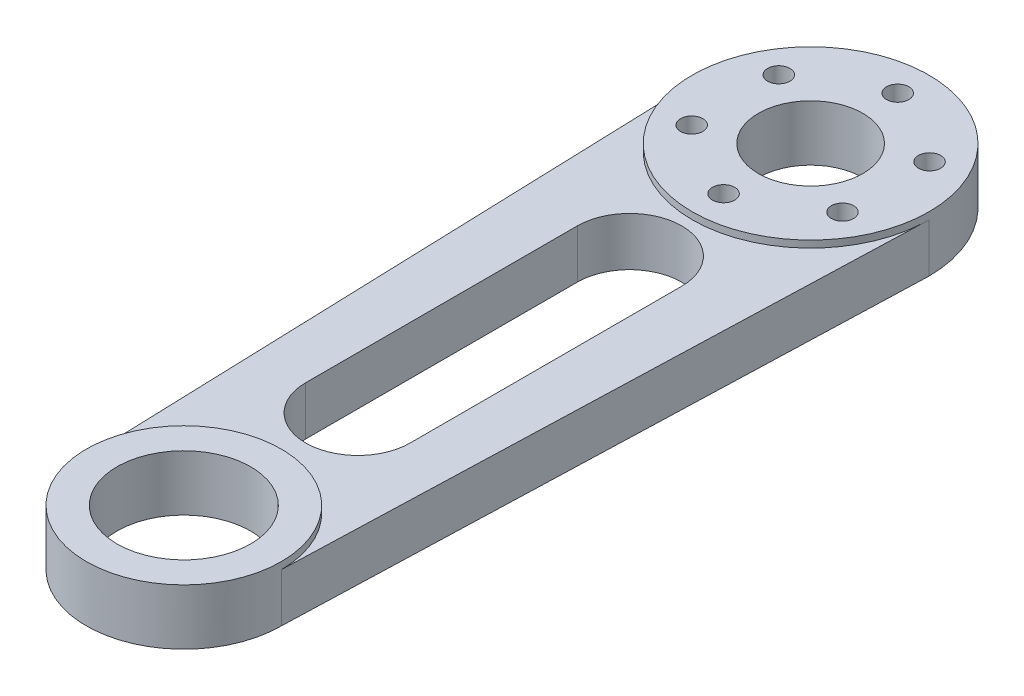
ISO-10303-21;
HEADER;
FILE_DESCRIPTION(('STEP AP214'),'2;1');
FILE_NAME('part.step','',(''),(''),'','','');
FILE_SCHEMA(('AUTOMOTIVE_DESIGN { 1 0 10303 214 1 1 1 1 }'));
ENDSEC;
DATA;
#1=APPLICATION_CONTEXT('core data for automotive mechanical design processes');
#2=APPLICATION_PROTOCOL_DEFINITION('international standard','automotive_design',2000,#1);
#3=PRODUCT_CONTEXT('',#1,'mechanical');
#4=PRODUCT('Part','Part','',(#3));
#5=PRODUCT_RELATED_PRODUCT_CATEGORY('part','',(#4));
#6=PRODUCT_DEFINITION_FORMATION('','',#4);
#7=PRODUCT_DEFINITION_CONTEXT('part definition',#1,'design');
#8=PRODUCT_DEFINITION('design','',#6,#7);
#9=PRODUCT_DEFINITION_SHAPE('','',#8);
#10=(LENGTH_UNIT() NAMED_UNIT(*) SI_UNIT(.MILLI.,.METRE.));
#11=(NAMED_UNIT(*) PLANE_ANGLE_UNIT() SI_UNIT($,.RADIAN.));
#12=(NAMED_UNIT(*) SI_UNIT($,.STERADIAN.) SOLID_ANGLE_UNIT());
#13=UNCERTAINTY_MEASURE_WITH_UNIT(LENGTH_MEASURE(1.E-05),#10,'distance_accuracy_value','');
#14=(GEOMETRIC_REPRESENTATION_CONTEXT(3) GLOBAL_UNCERTAINTY_ASSIGNED_CONTEXT((#13)) GLOBAL_UNIT_ASSIGNED_CONTEXT((#10,
#11,#12)) REPRESENTATION_CONTEXT('',''));
#15=CARTESIAN_POINT('',(0.,0.,0.));
#16=DIRECTION('',(0.,0.,1.));
#17=DIRECTION('',(1.,0.,0.));
#18=AXIS2_PLACEMENT_3D('',#15,#16,#17);
#19=CARTESIAN_POINT('',(0.,7.,0.));
#20=DIRECTION('',(0.,1.,0.));
#21=DIRECTION('',(0.,0.,1.));
#22=AXIS2_PLACEMENT_3D('',#19,#20,#21);
#23=PLANE('',#22);
#24=CARTESIAN_POINT('',(0.,7.,26.));
#25=DIRECTION('',(0.,1.,0.));
#26=DIRECTION('',(0.,0.,1.));
#27=AXIS2_PLACEMENT_3D('',#24,#25,#26);
#28=CIRCLE('',#27,7.5);
#29=CARTESIAN_POINT('',(7.5,7.,26.));
#30=VERTEX_POINT('',#29);
#31=CARTESIAN_POINT('',(-7.5,7.,26.));
#32=VERTEX_POINT('',#31);
#33=EDGE_CURVE('E59',#30,#32,#28,.T.);
#34=ORIENTED_EDGE('',*,*,#33,.F.);
#35=DIRECTION('',(0.,0.,-1.));
#36=VECTOR('',#35,1.);
#37=CARTESIAN_POINT('',(7.5,7.,26.));
#38=LINE('',#37,#36);
#39=CARTESIAN_POINT('',(7.50000000000001,7.,65.));
#40=VERTEX_POINT('',#39);
#41=EDGE_CURVE('E199',#40,#30,#38,.T.);
#42=ORIENTED_EDGE('',*,*,#41,.F.);
#43=CARTESIAN_POINT('',(0.,7.,65.));
#44=DIRECTION('',(0.,1.,0.));
#45=DIRECTION('',(0.,0.,1.));
#46=AXIS2_PLACEMENT_3D('',#43,#44,#45);
#47=CIRCLE('',#46,7.5);
#48=CARTESIAN_POINT('',(-7.49999999999999,7.,65.));
#49=VERTEX_POINT('',#48);
#50=EDGE_CURVE('E210',#49,#40,#47,.T.);
#51=ORIENTED_EDGE('',*,*,#50,.F.);
#52=DIRECTION('',(0.,0.,1.));
#53=VECTOR('',#52,1.);
#54=CARTESIAN_POINT('',(-7.5,7.,26.));
#55=LINE('',#54,#53);
#56=EDGE_CURVE('E212',#32,#49,#55,.T.);
#57=ORIENTED_EDGE('',*,*,#56,.F.);
#58=EDGE_LOOP('',(#34,#42,#51,#57));
#59=FACE_BOUND('',#58,.T.);
#60=DIRECTION('',(0.0333148302326388,0.,-0.999444906979154));
#61=VECTOR('',#60,1.);
#62=CARTESIAN_POINT('',(16.9811320754717,7.,0.566037735849062));
#63=LINE('',#62,#61);
#64=CARTESIAN_POINT('',(14.,7.,90.));
#65=VERTEX_POINT('',#64);
#66=CARTESIAN_POINT('',(16.9622641509434,7.,1.13207547169831));
#67=VERTEX_POINT('',#66);
#68=EDGE_CURVE('E126',#65,#67,#63,.T.);
#69=ORIENTED_EDGE('',*,*,#68,.T.);
#70=CARTESIAN_POINT('',(0.,7.,0.));
#71=DIRECTION('',(0.,1.,0.));
#72=DIRECTION('',(0.,0.,1.));
#73=AXIS2_PLACEMENT_3D('',#70,#71,#72);
#74=CIRCLE('',#73,17.);
#75=CARTESIAN_POINT('',(-16.9622641509434,7.,1.13207547169831));
#76=VERTEX_POINT('',#75);
#77=EDGE_CURVE('E11',#67,#76,#74,.F.);
#78=ORIENTED_EDGE('',*,*,#77,.T.);
#79=DIRECTION('',(-0.0333148302326388,0.,-0.999444906979154));
#80=VECTOR('',#79,1.);
#81=CARTESIAN_POINT('',(-16.9811320754717,7.,0.566037735849062));
#82=LINE('',#81,#80);
#83=CARTESIAN_POINT('',(-14.,7.,90.));
#84=VERTEX_POINT('',#83);
#85=EDGE_CURVE('E129',#84,#76,#82,.T.);
#86=ORIENTED_EDGE('',*,*,#85,.F.);
#87=CARTESIAN_POINT('',(0.,7.,90.));
#88=DIRECTION('',(0.,1.,0.));
#89=DIRECTION('',(0.,0.,1.));
#90=AXIS2_PLACEMENT_3D('',#87,#88,#89);
#91=CIRCLE('',#90,14.);
#92=EDGE_CURVE('E133',#65,#84,#91,.T.);
#93=ORIENTED_EDGE('',*,*,#92,.F.);
#94=EDGE_LOOP('',(#69,#78,#86,#93));
#95=FACE_BOUND('',#94,.T.);
#96=ADVANCED_FACE('F36',(#59,#95),#23,.T.);
#97=CARTESIAN_POINT('',(-16.9811320754717,7.,0.566037735849062));
#98=DIRECTION('',(-0.999444906979154,0.,0.0333148302326388));
#99=DIRECTION('',(0.0333148302326388,0.,0.999444906979154));
#100=AXIS2_PLACEMENT_3D('',#97,#98,#99);
#101=PLANE('',#100);
#102=DIRECTION('',(-0.0333148302326388,0.,-0.999444906979154));
#103=VECTOR('',#102,1.);
#104=CARTESIAN_POINT('',(-16.9811320754717,0.,0.566037735849062));
#105=LINE('',#104,#103);
#106=CARTESIAN_POINT('',(-14.,0.,90.));
#107=VERTEX_POINT('',#106);
#108=CARTESIAN_POINT('',(-17.,0.,0.));
#109=VERTEX_POINT('',#108);
#110=EDGE_CURVE('E139',#107,#109,#105,.T.);
#111=ORIENTED_EDGE('',*,*,#110,.F.);
#112=DIRECTION('',(0.,-1.,0.));
#113=VECTOR('',#112,1.);
#114=CARTESIAN_POINT('',(-14.,7.,90.));
#115=LINE('',#114,#113);
#116=EDGE_CURVE('E177',#84,#107,#115,.T.);
#117=ORIENTED_EDGE('',*,*,#116,.F.);
#118=ORIENTED_EDGE('',*,*,#85,.T.);
#119=CARTESIAN_POINT('',(-17.,7.,0.));
#120=VERTEX_POINT('',#119);
#121=EDGE_CURVE('E172',#76,#120,#82,.T.);
#122=ORIENTED_EDGE('',*,*,#121,.T.);
#123=DIRECTION('',(0.,-1.,0.));
#124=VECTOR('',#123,1.);
#125=CARTESIAN_POINT('',(-17.,7.,0.));
#126=LINE('',#125,#124);
#127=EDGE_CURVE('E134',#120,#109,#126,.T.);
#128=ORIENTED_EDGE('',*,*,#127,.T.);
#129=EDGE_LOOP('',(#111,#117,#118,#122,#128));
#130=FACE_BOUND('',#129,.T.);
#131=ADVANCED_FACE('F38',(#130),#101,.T.);
#132=CARTESIAN_POINT('',(0.,7.,90.));
#133=DIRECTION('',(0.,-1.,0.));
#134=DIRECTION('',(0.,0.,-1.));
#135=AXIS2_PLACEMENT_3D('',#132,#133,#134);
#136=CYLINDRICAL_SURFACE('',#135,14.);
#137=CARTESIAN_POINT('',(0.,0.,90.));
#138=DIRECTION('',(0.,1.,0.));
#139=DIRECTION('',(0.,0.,1.));
#140=AXIS2_PLACEMENT_3D('',#137,#138,#139);
#141=CIRCLE('',#140,14.);
#142=CARTESIAN_POINT('',(14.,0.,90.));
#143=VERTEX_POINT('',#142);
#144=EDGE_CURVE('E142',#107,#143,#141,.T.);
#145=ORIENTED_EDGE('',*,*,#144,.T.);
#146=DIRECTION('',(0.,-1.,0.));
#147=VECTOR('',#146,1.);
#148=CARTESIAN_POINT('',(14.,7.,90.));
#149=LINE('',#148,#147);
#150=EDGE_CURVE('E175',#65,#143,#149,.T.);
#151=ORIENTED_EDGE('',*,*,#150,.F.);
#152=ORIENTED_EDGE('',*,*,#92,.T.);
#153=ORIENTED_EDGE('',*,*,#116,.T.);
#154=EDGE_LOOP('',(#145,#151,#152,#153));
#155=FACE_BOUND('',#154,.T.);
#156=CARTESIAN_POINT('',(0.,8.,90.));
#157=DIRECTION('',(0.,1.,0.));
#158=DIRECTION('',(0.,0.,1.));
#159=AXIS2_PLACEMENT_3D('',#156,#157,#158);
#160=CIRCLE('',#159,14.);
#161=CARTESIAN_POINT('',(0.,8.,104.));
#162=VERTEX_POINT('',#161);
#163=EDGE_CURVE('E218',#162,#162,#160,.T.);
#164=ORIENTED_EDGE('',*,*,#163,.F.);
#165=EDGE_LOOP('',(#164));
#166=FACE_BOUND('',#165,.T.);
#167=ADVANCED_FACE('F271',(#155,#166),#136,.T.);
#168=CARTESIAN_POINT('',(16.9811320754717,7.,0.566037735849062));
#169=DIRECTION('',(-0.999444906979154,0.,-0.0333148302326388));
#170=DIRECTION('',(-0.0333148302326388,0.,0.999444906979154));
#171=AXIS2_PLACEMENT_3D('',#168,#169,#170);
#172=PLANE('',#171);
#173=DIRECTION('',(0.0333148302326388,0.,-0.999444906979154));
#174=VECTOR('',#173,1.);
#175=CARTESIAN_POINT('',(16.9811320754717,0.,0.566037735849062));
#176=LINE('',#175,#174);
#177=CARTESIAN_POINT('',(17.,0.,0.));
#178=VERTEX_POINT('',#177);
#179=EDGE_CURVE('E145',#143,#178,#176,.T.);
#180=ORIENTED_EDGE('',*,*,#179,.T.);
#181=DIRECTION('',(0.,-1.,0.));
#182=VECTOR('',#181,1.);
#183=CARTESIAN_POINT('',(17.,7.,0.));
#184=LINE('',#183,#182);
#185=CARTESIAN_POINT('',(17.,7.,-1.81712284108571E-13));
#186=VERTEX_POINT('',#185);
#187=EDGE_CURVE('E128',#186,#178,#184,.T.);
#188=ORIENTED_EDGE('',*,*,#187,.F.);
#189=EDGE_CURVE('E120',#67,#186,#63,.T.);
#190=ORIENTED_EDGE('',*,*,#189,.F.);
#191=ORIENTED_EDGE('',*,*,#68,.F.);
#192=ORIENTED_EDGE('',*,*,#150,.T.);
#193=EDGE_LOOP('',(#180,#188,#190,#191,#192));
#194=FACE_BOUND('',#193,.T.);
#195=ADVANCED_FACE('F124',(#194),#172,.F.);
#196=CARTESIAN_POINT('',(0.,7.,-12.5));
#197=DIRECTION('',(0.,-1.,0.));
#198=DIRECTION('',(0.,0.,-1.));
#199=AXIS2_PLACEMENT_3D('',#196,#197,#198);
#200=CYLINDRICAL_SURFACE('',#199,1.6);
#201=CARTESIAN_POINT('',(0.,0.,-12.5));
#202=DIRECTION('',(0.,1.,0.));
#203=DIRECTION('',(0.,0.,1.));
#204=AXIS2_PLACEMENT_3D('',#201,#202,#203);
#205=CIRCLE('',#204,1.6);
#206=CARTESIAN_POINT('',(0.,0.,-10.9));
#207=VERTEX_POINT('',#206);
#208=EDGE_CURVE('E167',#207,#207,#205,.T.);
#209=ORIENTED_EDGE('',*,*,#208,.F.);
#210=EDGE_LOOP('',(#209));
#211=FACE_BOUND('',#210,.T.);
#212=CARTESIAN_POINT('',(0.,8.,-12.5));
#213=DIRECTION('',(0.,1.,0.));
#214=DIRECTION('',(0.,0.,1.));
#215=AXIS2_PLACEMENT_3D('',#212,#213,#214);
#216=CIRCLE('',#215,1.6);
#217=CARTESIAN_POINT('',(0.,8.,-10.9));
#218=VERTEX_POINT('',#217);
#219=EDGE_CURVE('E230',#218,#218,#216,.T.);
#220=ORIENTED_EDGE('',*,*,#219,.T.);
#221=EDGE_LOOP('',(#220));
#222=FACE_BOUND('',#221,.T.);
#223=ADVANCED_FACE('F282',(#211,#222),#200,.F.);
#224=CARTESIAN_POINT('',(10.8253175473055,7.,-6.24999999999998));
#225=DIRECTION('',(0.,-1.,0.));
#226=DIRECTION('',(0.,0.,-1.));
#227=AXIS2_PLACEMENT_3D('',#224,#225,#226);
#228=CYLINDRICAL_SURFACE('',#227,1.6);
#229=CARTESIAN_POINT('',(10.8253175473055,0.,-6.24999999999998));
#230=DIRECTION('',(0.,1.,0.));
#231=DIRECTION('',(0.,0.,1.));
#232=AXIS2_PLACEMENT_3D('',#229,#230,#231);
#233=CIRCLE('',#232,1.6);
#234=CARTESIAN_POINT('',(10.8253175473055,0.,-4.64999999999998));
#235=VERTEX_POINT('',#234);
#236=EDGE_CURVE('E164',#235,#235,#233,.T.);
#237=ORIENTED_EDGE('',*,*,#236,.F.);
#238=EDGE_LOOP('',(#237));
#239=FACE_BOUND('',#238,.T.);
#240=CARTESIAN_POINT('',(10.8253175473057,8.,-6.25000000000046));
#241=DIRECTION('',(0.,1.,0.));
#242=DIRECTION('',(0.,0.,1.));
#243=AXIS2_PLACEMENT_3D('',#240,#241,#242);
#244=CIRCLE('',#243,1.60000000000015);
#245=CARTESIAN_POINT('',(10.8253175473057,8.,-4.65000000000031));
#246=VERTEX_POINT('',#245);
#247=EDGE_CURVE('E233',#246,#246,#244,.T.);
#248=ORIENTED_EDGE('',*,*,#247,.T.);
#249=EDGE_LOOP('',(#248));
#250=FACE_BOUND('',#249,.T.);
#251=ADVANCED_FACE('F285',(#239,#250),#228,.F.);
#252=CARTESIAN_POINT('',(10.8253175473063,7.,6.24999999999954));
#253=DIRECTION('',(0.,-1.,0.));
#254=DIRECTION('',(0.,0.,-1.));
#255=AXIS2_PLACEMENT_3D('',#252,#253,#254);
#256=CYLINDRICAL_SURFACE('',#255,1.6);
#257=CARTESIAN_POINT('',(10.8253175473063,0.,6.24999999999954));
#258=DIRECTION('',(0.,1.,0.));
#259=DIRECTION('',(0.,0.,1.));
#260=AXIS2_PLACEMENT_3D('',#257,#258,#259);
#261=CIRCLE('',#260,1.6);
#262=CARTESIAN_POINT('',(10.8253175473063,0.,7.84999999999954));
#263=VERTEX_POINT('',#262);
#264=EDGE_CURVE('E161',#263,#263,#261,.T.);
#265=ORIENTED_EDGE('',*,*,#264,.F.);
#266=EDGE_LOOP('',(#265));
#267=FACE_BOUND('',#266,.T.);
#268=CARTESIAN_POINT('',(10.8253175473063,8.,6.24999999999954));
#269=DIRECTION('',(0.,1.,0.));
#270=DIRECTION('',(0.,0.,1.));
#271=AXIS2_PLACEMENT_3D('',#268,#269,#270);
#272=CIRCLE('',#271,1.60000000000069);
#273=CARTESIAN_POINT('',(10.8253175473063,8.,7.85000000000023));
#274=VERTEX_POINT('',#273);
#275=EDGE_CURVE('E236',#274,#274,#272,.T.);
#276=ORIENTED_EDGE('',*,*,#275,.T.);
#277=EDGE_LOOP('',(#276));
#278=FACE_BOUND('',#277,.T.);
#279=ADVANCED_FACE('F289',(#267,#278),#256,.F.);
#280=CARTESIAN_POINT('',(1.06122167814335E-12,7.,12.5));
#281=DIRECTION('',(0.,-1.,0.));
#282=DIRECTION('',(0.,0.,-1.));
#283=AXIS2_PLACEMENT_3D('',#280,#281,#282);
#284=CYLINDRICAL_SURFACE('',#283,1.6);
#285=CARTESIAN_POINT('',(1.06122167814335E-12,0.,12.5));
#286=DIRECTION('',(0.,1.,0.));
#287=DIRECTION('',(0.,0.,1.));
#288=AXIS2_PLACEMENT_3D('',#285,#286,#287);
#289=CIRCLE('',#288,1.6);
#290=CARTESIAN_POINT('',(1.06122167814335E-12,0.,14.1));
#291=VERTEX_POINT('',#290);
#292=EDGE_CURVE('E158',#291,#291,#289,.T.);
#293=ORIENTED_EDGE('',*,*,#292,.F.);
#294=EDGE_LOOP('',(#293));
#295=FACE_BOUND('',#294,.T.);
#296=CARTESIAN_POINT('',(1.06122167814335E-12,8.,12.5));
#297=DIRECTION('',(0.,1.,0.));
#298=DIRECTION('',(0.,0.,1.));
#299=AXIS2_PLACEMENT_3D('',#296,#297,#298);
#300=CIRCLE('',#299,1.6000000000011);
#301=CARTESIAN_POINT('',(1.06122167814335E-12,8.,14.1000000000011));
#302=VERTEX_POINT('',#301);
#303=EDGE_CURVE('E239',#302,#302,#300,.T.);
#304=ORIENTED_EDGE('',*,*,#303,.T.);
#305=EDGE_LOOP('',(#304));
#306=FACE_BOUND('',#305,.T.);
#307=ADVANCED_FACE('F293',(#295,#306),#284,.F.);
#308=CARTESIAN_POINT('',(-10.8253175473047,7.,6.25000000000046));
#309=DIRECTION('',(0.,-1.,0.));
#310=DIRECTION('',(0.,0.,-1.));
#311=AXIS2_PLACEMENT_3D('',#308,#309,#310);
#312=CYLINDRICAL_SURFACE('',#311,1.6);
#313=CARTESIAN_POINT('',(-10.8253175473047,0.,6.25000000000046));
#314=DIRECTION('',(0.,1.,0.));
#315=DIRECTION('',(0.,0.,1.));
#316=AXIS2_PLACEMENT_3D('',#313,#314,#315);
#317=CIRCLE('',#316,1.6);
#318=CARTESIAN_POINT('',(-10.8253175473047,0.,7.85000000000046));
#319=VERTEX_POINT('',#318);
#320=EDGE_CURVE('E155',#319,#319,#317,.T.);
#321=ORIENTED_EDGE('',*,*,#320,.F.);
#322=EDGE_LOOP('',(#321));
#323=FACE_BOUND('',#322,.T.);
#324=CARTESIAN_POINT('',(-10.8253175473047,8.,6.25000000000046));
#325=DIRECTION('',(0.,1.,0.));
#326=DIRECTION('',(0.,0.,1.));
#327=AXIS2_PLACEMENT_3D('',#324,#325,#326);
#328=CIRCLE('',#327,1.60000000000101);
#329=CARTESIAN_POINT('',(-10.8253175473047,8.,7.85000000000148));
#330=VERTEX_POINT('',#329);
#331=EDGE_CURVE('E242',#330,#330,#328,.T.);
#332=ORIENTED_EDGE('',*,*,#331,.T.);
#333=EDGE_LOOP('',(#332));
#334=FACE_BOUND('',#333,.T.);
#335=ADVANCED_FACE('F297',(#323,#334),#312,.F.);
#336=CARTESIAN_POINT('',(-10.8253175473054,7.,-6.25000000000013));
#337=DIRECTION('',(0.,-1.,0.));
#338=DIRECTION('',(0.,0.,-1.));
#339=AXIS2_PLACEMENT_3D('',#336,#337,#338);
#340=CYLINDRICAL_SURFACE('',#339,1.6);
#341=CARTESIAN_POINT('',(-10.8253175473054,0.,-6.25000000000013));
#342=DIRECTION('',(0.,1.,0.));
#343=DIRECTION('',(0.,0.,1.));
#344=AXIS2_PLACEMENT_3D('',#341,#342,#343);
#345=CIRCLE('',#344,1.6);
#346=CARTESIAN_POINT('',(-10.8253175473054,0.,-4.65000000000013));
#347=VERTEX_POINT('',#346);
#348=EDGE_CURVE('E152',#347,#347,#345,.T.);
#349=ORIENTED_EDGE('',*,*,#348,.F.);
#350=EDGE_LOOP('',(#349));
#351=FACE_BOUND('',#350,.T.);
#352=CARTESIAN_POINT('',(-10.8253175473052,8.,-6.24999999999953));
#353=DIRECTION('',(0.,1.,0.));
#354=DIRECTION('',(0.,0.,1.));
#355=AXIS2_PLACEMENT_3D('',#352,#353,#354);
#356=CIRCLE('',#355,1.60000000000054);
#357=CARTESIAN_POINT('',(-10.8253175473052,8.,-4.64999999999899));
#358=VERTEX_POINT('',#357);
#359=EDGE_CURVE('E245',#358,#358,#356,.T.);
#360=ORIENTED_EDGE('',*,*,#359,.T.);
#361=EDGE_LOOP('',(#360));
#362=FACE_BOUND('',#361,.T.);
#363=ADVANCED_FACE('F249',(#351,#362),#340,.F.);
#364=CARTESIAN_POINT('',(0.,7.,0.));
#365=DIRECTION('',(0.,-1.,0.));
#366=DIRECTION('',(0.,0.,-1.));
#367=AXIS2_PLACEMENT_3D('',#364,#365,#366);
#368=CYLINDRICAL_SURFACE('',#367,7.5);
#369=CARTESIAN_POINT('',(0.,0.,0.));
#370=DIRECTION('',(0.,1.,0.));
#371=DIRECTION('',(0.,0.,1.));
#372=AXIS2_PLACEMENT_3D('',#369,#370,#371);
#373=CIRCLE('',#372,7.5);
#374=CARTESIAN_POINT('',(0.,0.,7.5));
#375=VERTEX_POINT('',#374);
#376=EDGE_CURVE('E149',#375,#375,#373,.T.);
#377=ORIENTED_EDGE('',*,*,#376,.F.);
#378=EDGE_LOOP('',(#377));
#379=FACE_BOUND('',#378,.T.);
#380=CARTESIAN_POINT('',(0.,8.,0.));
#381=DIRECTION('',(0.,1.,0.));
#382=DIRECTION('',(0.,0.,1.));
#383=AXIS2_PLACEMENT_3D('',#380,#381,#382);
#384=CIRCLE('',#383,7.5);
#385=CARTESIAN_POINT('',(0.,8.,7.5));
#386=VERTEX_POINT('',#385);
#387=EDGE_CURVE('E227',#386,#386,#384,.T.);
#388=ORIENTED_EDGE('',*,*,#387,.T.);
#389=EDGE_LOOP('',(#388));
#390=FACE_BOUND('',#389,.T.);
#391=ADVANCED_FACE('F304',(#379,#390),#368,.F.);
#392=CARTESIAN_POINT('',(0.,7.,0.));
#393=DIRECTION('',(0.,-1.,0.));
#394=DIRECTION('',(0.,0.,-1.));
#395=AXIS2_PLACEMENT_3D('',#392,#393,#394);
#396=CYLINDRICAL_SURFACE('',#395,17.);
#397=CARTESIAN_POINT('',(0.,0.,0.));
#398=DIRECTION('',(0.,1.,0.));
#399=DIRECTION('',(0.,0.,1.));
#400=AXIS2_PLACEMENT_3D('',#397,#398,#399);
#401=CIRCLE('',#400,17.);
#402=EDGE_CURVE('E147',#178,#109,#401,.T.);
#403=ORIENTED_EDGE('',*,*,#402,.T.);
#404=ORIENTED_EDGE('',*,*,#127,.F.);
#405=CARTESIAN_POINT('',(0.,7.,0.));
#406=DIRECTION('',(0.,1.,0.));
#407=DIRECTION('',(0.,0.,1.));
#408=AXIS2_PLACEMENT_3D('',#405,#406,#407);
#409=CIRCLE('',#408,17.);
#410=EDGE_CURVE('E51',#120,#76,#409,.T.);
#411=ORIENTED_EDGE('',*,*,#410,.T.);
#412=ORIENTED_EDGE('',*,*,#77,.F.);
#413=EDGE_CURVE('E111',#67,#186,#409,.T.);
#414=ORIENTED_EDGE('',*,*,#413,.T.);
#415=ORIENTED_EDGE('',*,*,#187,.T.);
#416=EDGE_LOOP('',(#403,#404,#411,#412,#414,#415));
#417=FACE_BOUND('',#416,.T.);
#418=CARTESIAN_POINT('',(0.,8.,0.));
#419=DIRECTION('',(0.,1.,0.));
#420=DIRECTION('',(0.,0.,1.));
#421=AXIS2_PLACEMENT_3D('',#418,#419,#420);
#422=CIRCLE('',#421,17.);
#423=CARTESIAN_POINT('',(0.,8.,17.));
#424=VERTEX_POINT('',#423);
#425=EDGE_CURVE('E121',#424,#424,#422,.T.);
#426=ORIENTED_EDGE('',*,*,#425,.F.);
#427=EDGE_LOOP('',(#426));
#428=FACE_BOUND('',#427,.T.);
#429=ADVANCED_FACE('F108',(#417,#428),#396,.T.);
#430=CARTESIAN_POINT('',(0.,7.,90.));
#431=DIRECTION('',(0.,-1.,0.));
#432=DIRECTION('',(0.,0.,-1.));
#433=AXIS2_PLACEMENT_3D('',#430,#431,#432);
#434=CYLINDRICAL_SURFACE('',#433,9.6);
#435=CARTESIAN_POINT('',(0.,0.,90.));
#436=DIRECTION('',(0.,1.,0.));
#437=DIRECTION('',(0.,0.,1.));
#438=AXIS2_PLACEMENT_3D('',#435,#436,#437);
#439=CIRCLE('',#438,9.6);
#440=CARTESIAN_POINT('',(0.,0.,99.6));
#441=VERTEX_POINT('',#440);
#442=EDGE_CURVE('E170',#441,#441,#439,.T.);
#443=ORIENTED_EDGE('',*,*,#442,.F.);
#444=EDGE_LOOP('',(#443));
#445=FACE_BOUND('',#444,.T.);
#446=CARTESIAN_POINT('',(0.,8.,90.));
#447=DIRECTION('',(0.,1.,0.));
#448=DIRECTION('',(0.,0.,1.));
#449=AXIS2_PLACEMENT_3D('',#446,#447,#448);
#450=CIRCLE('',#449,9.6);
#451=CARTESIAN_POINT('',(0.,8.,99.6));
#452=VERTEX_POINT('',#451);
#453=EDGE_CURVE('E220',#452,#452,#450,.T.);
#454=ORIENTED_EDGE('',*,*,#453,.T.);
#455=EDGE_LOOP('',(#454));
#456=FACE_BOUND('',#455,.T.);
#457=ADVANCED_FACE('F278',(#445,#456),#434,.F.);
#458=CARTESIAN_POINT('',(0.,0.,0.));
#459=DIRECTION('',(0.,1.,0.));
#460=DIRECTION('',(0.,0.,1.));
#461=AXIS2_PLACEMENT_3D('',#458,#459,#460);
#462=PLANE('',#461);
#463=DIRECTION('',(0.,0.,-1.));
#464=VECTOR('',#463,1.);
#465=CARTESIAN_POINT('',(7.5,0.,0.));
#466=LINE('',#465,#464);
#467=CARTESIAN_POINT('',(7.50000000000001,0.,65.));
#468=VERTEX_POINT('',#467);
#469=CARTESIAN_POINT('',(7.5,0.,26.));
#470=VERTEX_POINT('',#469);
#471=EDGE_CURVE('E185',#468,#470,#466,.T.);
#472=ORIENTED_EDGE('',*,*,#471,.T.);
#473=CARTESIAN_POINT('',(0.,0.,26.));
#474=DIRECTION('',(0.,1.,0.));
#475=DIRECTION('',(0.,0.,1.));
#476=AXIS2_PLACEMENT_3D('',#473,#474,#475);
#477=CIRCLE('',#476,7.5);
#478=CARTESIAN_POINT('',(-7.5,0.,26.));
#479=VERTEX_POINT('',#478);
#480=EDGE_CURVE('E44',#470,#479,#477,.T.);
#481=ORIENTED_EDGE('',*,*,#480,.T.);
#482=DIRECTION('',(0.,0.,1.));
#483=VECTOR('',#482,1.);
#484=CARTESIAN_POINT('',(-7.5,0.,0.));
#485=LINE('',#484,#483);
#486=CARTESIAN_POINT('',(-7.49999999999999,0.,65.));
#487=VERTEX_POINT('',#486);
#488=EDGE_CURVE('E179',#479,#487,#485,.T.);
#489=ORIENTED_EDGE('',*,*,#488,.T.);
#490=CARTESIAN_POINT('',(0.,0.,65.));
#491=DIRECTION('',(0.,1.,0.));
#492=DIRECTION('',(0.,0.,1.));
#493=AXIS2_PLACEMENT_3D('',#490,#491,#492);
#494=CIRCLE('',#493,7.5);
#495=EDGE_CURVE('E182',#487,#468,#494,.T.);
#496=ORIENTED_EDGE('',*,*,#495,.T.);
#497=EDGE_LOOP('',(#472,#481,#489,#496));
#498=FACE_BOUND('',#497,.T.);
#499=ORIENTED_EDGE('',*,*,#110,.T.);
#500=ORIENTED_EDGE('',*,*,#402,.F.);
#501=ORIENTED_EDGE('',*,*,#179,.F.);
#502=ORIENTED_EDGE('',*,*,#144,.F.);
#503=EDGE_LOOP('',(#499,#500,#501,#502));
#504=FACE_BOUND('',#503,.T.);
#505=ORIENTED_EDGE('',*,*,#376,.T.);
#506=EDGE_LOOP('',(#505));
#507=FACE_BOUND('',#506,.T.);
#508=ORIENTED_EDGE('',*,*,#348,.T.);
#509=EDGE_LOOP('',(#508));
#510=FACE_BOUND('',#509,.T.);
#511=ORIENTED_EDGE('',*,*,#320,.T.);
#512=EDGE_LOOP('',(#511));
#513=FACE_BOUND('',#512,.T.);
#514=ORIENTED_EDGE('',*,*,#292,.T.);
#515=EDGE_LOOP('',(#514));
#516=FACE_BOUND('',#515,.T.);
#517=ORIENTED_EDGE('',*,*,#264,.T.);
#518=EDGE_LOOP('',(#517));
#519=FACE_BOUND('',#518,.T.);
#520=ORIENTED_EDGE('',*,*,#236,.T.);
#521=EDGE_LOOP('',(#520));
#522=FACE_BOUND('',#521,.T.);
#523=ORIENTED_EDGE('',*,*,#208,.T.);
#524=EDGE_LOOP('',(#523));
#525=FACE_BOUND('',#524,.T.);
#526=ORIENTED_EDGE('',*,*,#442,.T.);
#527=EDGE_LOOP('',(#526));
#528=FACE_BOUND('',#527,.T.);
#529=ADVANCED_FACE('F189',(#498,#504,#507,#510,#513,#516,#519,#522,#525,#528),#462,.F.);
#530=CARTESIAN_POINT('',(0.,-1.,26.));
#531=DIRECTION('',(0.,1.,0.));
#532=DIRECTION('',(0.,0.,1.));
#533=AXIS2_PLACEMENT_3D('',#530,#531,#532);
#534=CYLINDRICAL_SURFACE('',#533,7.5);
#535=DIRECTION('',(0.,1.,0.));
#536=VECTOR('',#535,1.);
#537=CARTESIAN_POINT('',(7.5,-1.,26.));
#538=LINE('',#537,#536);
#539=EDGE_CURVE('E143',#470,#30,#538,.T.);
#540=ORIENTED_EDGE('',*,*,#539,.T.);
#541=ORIENTED_EDGE('',*,*,#33,.T.);
#542=DIRECTION('',(0.,1.,0.));
#543=VECTOR('',#542,1.);
#544=CARTESIAN_POINT('',(-7.5,-1.,26.));
#545=LINE('',#544,#543);
#546=EDGE_CURVE('E194',#479,#32,#545,.T.);
#547=ORIENTED_EDGE('',*,*,#546,.F.);
#548=ORIENTED_EDGE('',*,*,#480,.F.);
#549=EDGE_LOOP('',(#540,#541,#547,#548));
#550=FACE_BOUND('',#549,.T.);
#551=ADVANCED_FACE('F192',(#550),#534,.F.);
#552=CARTESIAN_POINT('',(7.5,-1.,26.));
#553=DIRECTION('',(1.,0.,0.));
#554=DIRECTION('',(0.,0.,-1.));
#555=AXIS2_PLACEMENT_3D('',#552,#553,#554);
#556=PLANE('',#555);
#557=DIRECTION('',(0.,1.,0.));
#558=VECTOR('',#557,1.);
#559=CARTESIAN_POINT('',(7.50000000000001,-1.,65.));
#560=LINE('',#559,#558);
#561=EDGE_CURVE('E200',#468,#40,#560,.T.);
#562=ORIENTED_EDGE('',*,*,#561,.T.);
#563=ORIENTED_EDGE('',*,*,#41,.T.);
#564=ORIENTED_EDGE('',*,*,#539,.F.);
#565=ORIENTED_EDGE('',*,*,#471,.F.);
#566=EDGE_LOOP('',(#562,#563,#564,#565));
#567=FACE_BOUND('',#566,.T.);
#568=ADVANCED_FACE('F196',(#567),#556,.F.);
#569=CARTESIAN_POINT('',(0.,-1.,65.));
#570=DIRECTION('',(0.,1.,0.));
#571=DIRECTION('',(0.,0.,1.));
#572=AXIS2_PLACEMENT_3D('',#569,#570,#571);
#573=CYLINDRICAL_SURFACE('',#572,7.5);
#574=DIRECTION('',(0.,1.,0.));
#575=VECTOR('',#574,1.);
#576=CARTESIAN_POINT('',(-7.49999999999999,-1.,65.));
#577=LINE('',#576,#575);
#578=EDGE_CURVE('E202',#487,#49,#577,.T.);
#579=ORIENTED_EDGE('',*,*,#578,.T.);
#580=ORIENTED_EDGE('',*,*,#50,.T.);
#581=ORIENTED_EDGE('',*,*,#561,.F.);
#582=ORIENTED_EDGE('',*,*,#495,.F.);
#583=EDGE_LOOP('',(#579,#580,#581,#582));
#584=FACE_BOUND('',#583,.T.);
#585=ADVANCED_FACE('F329',(#584),#573,.F.);
#586=CARTESIAN_POINT('',(-7.5,-1.,26.));
#587=DIRECTION('',(-1.,0.,0.));
#588=DIRECTION('',(0.,0.,1.));
#589=AXIS2_PLACEMENT_3D('',#586,#587,#588);
#590=PLANE('',#589);
#591=ORIENTED_EDGE('',*,*,#546,.T.);
#592=ORIENTED_EDGE('',*,*,#56,.T.);
#593=ORIENTED_EDGE('',*,*,#578,.F.);
#594=ORIENTED_EDGE('',*,*,#488,.F.);
#595=EDGE_LOOP('',(#591,#592,#593,#594));
#596=FACE_BOUND('',#595,.T.);
#597=ADVANCED_FACE('F322',(#596),#590,.F.);
#598=CARTESIAN_POINT('',(0.,8.,90.));
#599=DIRECTION('',(0.,1.,0.));
#600=DIRECTION('',(0.,0.,1.));
#601=AXIS2_PLACEMENT_3D('',#598,#599,#600);
#602=PLANE('',#601);
#603=ORIENTED_EDGE('',*,*,#163,.T.);
#604=EDGE_LOOP('',(#603));
#605=FACE_BOUND('',#604,.T.);
#606=ORIENTED_EDGE('',*,*,#453,.F.);
#607=EDGE_LOOP('',(#606));
#608=FACE_BOUND('',#607,.T.);
#609=ADVANCED_FACE('F262',(#605,#608),#602,.T.);
#610=CARTESIAN_POINT('',(0.,7.,0.));
#611=DIRECTION('',(0.,1.,0.));
#612=DIRECTION('',(0.,0.,1.));
#613=AXIS2_PLACEMENT_3D('',#610,#611,#612);
#614=PLANE('',#613);
#615=ORIENTED_EDGE('',*,*,#413,.F.);
#616=ORIENTED_EDGE('',*,*,#189,.T.);
#617=EDGE_LOOP('',(#615,#616));
#618=FACE_BOUND('',#617,.T.);
#619=ADVANCED_FACE('F119',(#618),#614,.F.);
#620=CARTESIAN_POINT('',(0.,8.,0.));
#621=DIRECTION('',(0.,1.,0.));
#622=DIRECTION('',(0.,0.,1.));
#623=AXIS2_PLACEMENT_3D('',#620,#621,#622);
#624=PLANE('',#623);
#625=ORIENTED_EDGE('',*,*,#331,.F.);
#626=EDGE_LOOP('',(#625));
#627=FACE_BOUND('',#626,.T.);
#628=ORIENTED_EDGE('',*,*,#275,.F.);
#629=EDGE_LOOP('',(#628));
#630=FACE_BOUND('',#629,.T.);
#631=ORIENTED_EDGE('',*,*,#219,.F.);
#632=EDGE_LOOP('',(#631));
#633=FACE_BOUND('',#632,.T.);
#634=ORIENTED_EDGE('',*,*,#425,.T.);
#635=EDGE_LOOP('',(#634));
#636=FACE_BOUND('',#635,.T.);
#637=ORIENTED_EDGE('',*,*,#387,.F.);
#638=EDGE_LOOP('',(#637));
#639=FACE_BOUND('',#638,.T.);
#640=ORIENTED_EDGE('',*,*,#247,.F.);
#641=EDGE_LOOP('',(#640));
#642=FACE_BOUND('',#641,.T.);
#643=ORIENTED_EDGE('',*,*,#303,.F.);
#644=EDGE_LOOP('',(#643));
#645=FACE_BOUND('',#644,.T.);
#646=ORIENTED_EDGE('',*,*,#359,.F.);
#647=EDGE_LOOP('',(#646));
#648=FACE_BOUND('',#647,.T.);
#649=ADVANCED_FACE('F251',(#627,#630,#633,#636,#639,#642,#645,#648),#624,.T.);
#650=ORIENTED_EDGE('',*,*,#121,.F.);
#651=ORIENTED_EDGE('',*,*,#410,.F.);
#652=EDGE_LOOP('',(#650,#651));
#653=FACE_BOUND('',#652,.T.);
#654=ADVANCED_FACE('F253',(#653),#614,.F.);
#655=CLOSED_SHELL('',(#96,#131,#167,#195,#223,#251,#279,#307,#335,#363,#391,#429,#457,#529,#551,
#568,#585,#597,#609,#619,#649,#654));
#656=MANIFOLD_SOLID_BREP('B2',#655);
#657=ADVANCED_BREP_SHAPE_REPRESENTATION('',(#18,#656),#14);
#658=SHAPE_DEFINITION_REPRESENTATION(#9,#657);
ENDSEC;
END-ISO-10303-21;
